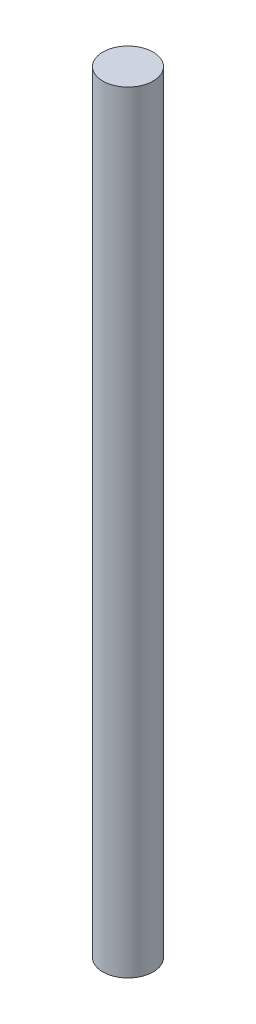
ISO-10303-21;
HEADER;
FILE_DESCRIPTION(('STEP AP214'),'2;1');
FILE_NAME('part.step','',(''),(''),'','','');
FILE_SCHEMA(('AUTOMOTIVE_DESIGN { 1 0 10303 214 1 1 1 1 }'));
ENDSEC;
DATA;
#1=APPLICATION_CONTEXT('core data for automotive mechanical design processes');
#2=APPLICATION_PROTOCOL_DEFINITION('international standard','automotive_design',2000,#1);
#3=PRODUCT_CONTEXT('',#1,'mechanical');
#4=PRODUCT('Part','Part','',(#3));
#5=PRODUCT_RELATED_PRODUCT_CATEGORY('part','',(#4));
#6=PRODUCT_DEFINITION_FORMATION('','',#4);
#7=PRODUCT_DEFINITION_CONTEXT('part definition',#1,'design');
#8=PRODUCT_DEFINITION('design','',#6,#7);
#9=PRODUCT_DEFINITION_SHAPE('','',#8);
#10=(LENGTH_UNIT() NAMED_UNIT(*) SI_UNIT(.MILLI.,.METRE.));
#11=(NAMED_UNIT(*) PLANE_ANGLE_UNIT() SI_UNIT($,.RADIAN.));
#12=(NAMED_UNIT(*) SI_UNIT($,.STERADIAN.) SOLID_ANGLE_UNIT());
#13=UNCERTAINTY_MEASURE_WITH_UNIT(LENGTH_MEASURE(1.E-05),#10,'distance_accuracy_value','');
#14=(GEOMETRIC_REPRESENTATION_CONTEXT(3) GLOBAL_UNCERTAINTY_ASSIGNED_CONTEXT((#13)) GLOBAL_UNIT_ASSIGNED_CONTEXT((#10,
#11,#12)) REPRESENTATION_CONTEXT('',''));
#15=CARTESIAN_POINT('',(0.,0.,0.));
#16=DIRECTION('',(0.,0.,1.));
#17=DIRECTION('',(1.,0.,0.));
#18=AXIS2_PLACEMENT_3D('',#15,#16,#17);
#19=CARTESIAN_POINT('',(0.,46.,0.));
#20=DIRECTION('',(0.,-1.,0.));
#21=DIRECTION('',(0.,0.,-1.));
#22=AXIS2_PLACEMENT_3D('',#19,#20,#21);
#23=CYLINDRICAL_SURFACE('',#22,1.5);
#24=CARTESIAN_POINT('',(0.,46.,0.));
#25=DIRECTION('',(0.,1.,0.));
#26=DIRECTION('',(0.,0.,1.));
#27=AXIS2_PLACEMENT_3D('',#24,#25,#26);
#28=CIRCLE('',#27,1.5);
#29=CARTESIAN_POINT('',(0.,46.,1.5));
#30=VERTEX_POINT('',#29);
#31=EDGE_CURVE('E10',#30,#30,#28,.T.);
#32=ORIENTED_EDGE('',*,*,#31,.F.);
#33=EDGE_LOOP('',(#32));
#34=FACE_BOUND('',#33,.T.);
#35=CARTESIAN_POINT('',(0.,0.,0.));
#36=DIRECTION('',(0.,1.,0.));
#37=DIRECTION('',(0.,0.,1.));
#38=AXIS2_PLACEMENT_3D('',#35,#36,#37);
#39=CIRCLE('',#38,1.5);
#40=CARTESIAN_POINT('',(0.,0.,1.5));
#41=VERTEX_POINT('',#40);
#42=EDGE_CURVE('E34',#41,#41,#39,.T.);
#43=ORIENTED_EDGE('',*,*,#42,.T.);
#44=EDGE_LOOP('',(#43));
#45=FACE_BOUND('',#44,.T.);
#46=ADVANCED_FACE('F31',(#34,#45),#23,.T.);
#47=CARTESIAN_POINT('',(0.,46.,0.));
#48=DIRECTION('',(0.,1.,0.));
#49=DIRECTION('',(0.,0.,1.));
#50=AXIS2_PLACEMENT_3D('',#47,#48,#49);
#51=PLANE('',#50);
#52=ORIENTED_EDGE('',*,*,#31,.T.);
#53=EDGE_LOOP('',(#52));
#54=FACE_BOUND('',#53,.T.);
#55=ADVANCED_FACE('F46',(#54),#51,.T.);
#56=CARTESIAN_POINT('',(0.,0.,0.));
#57=DIRECTION('',(0.,1.,0.));
#58=DIRECTION('',(0.,0.,1.));
#59=AXIS2_PLACEMENT_3D('',#56,#57,#58);
#60=PLANE('',#59);
#61=ORIENTED_EDGE('',*,*,#42,.F.);
#62=EDGE_LOOP('',(#61));
#63=FACE_BOUND('',#62,.T.);
#64=ADVANCED_FACE('F44',(#63),#60,.F.);
#65=CLOSED_SHELL('',(#46,#55,#64));
#66=MANIFOLD_SOLID_BREP('B2',#65);
#67=ADVANCED_BREP_SHAPE_REPRESENTATION('',(#18,#66),#14);
#68=SHAPE_DEFINITION_REPRESENTATION(#9,#67);
ENDSEC;
END-ISO-10303-21;
